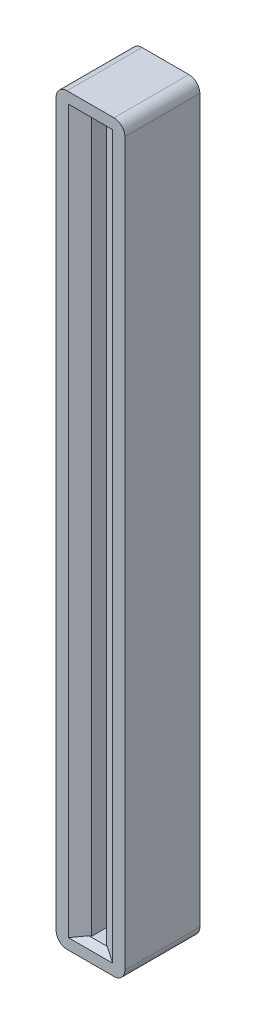
ISO-10303-21;
HEADER;
FILE_DESCRIPTION(('STEP AP214'),'2;1');
FILE_NAME('part.step','',(''),(''),'','','');
FILE_SCHEMA(('AUTOMOTIVE_DESIGN { 1 0 10303 214 1 1 1 1 }'));
ENDSEC;
DATA;
#1=APPLICATION_CONTEXT('core data for automotive mechanical design processes');
#2=APPLICATION_PROTOCOL_DEFINITION('international standard','automotive_design',2000,#1);
#3=PRODUCT_CONTEXT('',#1,'mechanical');
#4=PRODUCT('Part','Part','',(#3));
#5=PRODUCT_RELATED_PRODUCT_CATEGORY('part','',(#4));
#6=PRODUCT_DEFINITION_FORMATION('','',#4);
#7=PRODUCT_DEFINITION_CONTEXT('part definition',#1,'design');
#8=PRODUCT_DEFINITION('design','',#6,#7);
#9=PRODUCT_DEFINITION_SHAPE('','',#8);
#10=(LENGTH_UNIT() NAMED_UNIT(*) SI_UNIT(.MILLI.,.METRE.));
#11=(NAMED_UNIT(*) PLANE_ANGLE_UNIT() SI_UNIT($,.RADIAN.));
#12=(NAMED_UNIT(*) SI_UNIT($,.STERADIAN.) SOLID_ANGLE_UNIT());
#13=UNCERTAINTY_MEASURE_WITH_UNIT(LENGTH_MEASURE(1.E-05),#10,'distance_accuracy_value','');
#14=(GEOMETRIC_REPRESENTATION_CONTEXT(3) GLOBAL_UNCERTAINTY_ASSIGNED_CONTEXT((#13)) GLOBAL_UNIT_ASSIGNED_CONTEXT((#10,
#11,#12)) REPRESENTATION_CONTEXT('',''));
#15=CARTESIAN_POINT('',(0.,0.,0.));
#16=DIRECTION('',(0.,0.,1.));
#17=DIRECTION('',(1.,0.,0.));
#18=AXIS2_PLACEMENT_3D('',#15,#16,#17);
#19=CARTESIAN_POINT('',(-5.01650000000038,54.2925,10.9474));
#20=DIRECTION('',(1.,0.,0.));
#21=DIRECTION('',(0.,0.,-1.));
#22=AXIS2_PLACEMENT_3D('',#19,#20,#21);
#23=PLANE('',#22);
#24=DIRECTION('',(0.,-1.,0.));
#25=VECTOR('',#24,1.);
#26=CARTESIAN_POINT('',(-5.01650000000038,54.2925,0.));
#27=LINE('',#26,#25);
#28=CARTESIAN_POINT('',(-5.01650000000038,52.705,0.));
#29=VERTEX_POINT('',#28);
#30=CARTESIAN_POINT('',(-5.01649999999962,-52.705,0.));
#31=VERTEX_POINT('',#30);
#32=EDGE_CURVE('E175',#29,#31,#27,.T.);
#33=ORIENTED_EDGE('',*,*,#32,.T.);
#34=DIRECTION('',(0.,0.,-1.));
#35=VECTOR('',#34,1.);
#36=CARTESIAN_POINT('',(-5.01649999999962,-52.705,10.9474));
#37=LINE('',#36,#35);
#38=CARTESIAN_POINT('',(-5.01649999999962,-52.705,10.9474));
#39=VERTEX_POINT('',#38);
#40=EDGE_CURVE('E237',#31,#39,#37,.F.);
#41=ORIENTED_EDGE('',*,*,#40,.T.);
#42=DIRECTION('',(0.,-1.,0.));
#43=VECTOR('',#42,1.);
#44=CARTESIAN_POINT('',(-5.01650000000038,54.2925,10.9474));
#45=LINE('',#44,#43);
#46=CARTESIAN_POINT('',(-5.01650000000038,52.705,10.9474));
#47=VERTEX_POINT('',#46);
#48=EDGE_CURVE('E191',#47,#39,#45,.T.);
#49=ORIENTED_EDGE('',*,*,#48,.F.);
#50=DIRECTION('',(0.,0.,-1.));
#51=VECTOR('',#50,1.);
#52=CARTESIAN_POINT('',(-5.01650000000038,52.705,10.9474));
#53=LINE('',#52,#51);
#54=EDGE_CURVE('E234',#47,#29,#53,.T.);
#55=ORIENTED_EDGE('',*,*,#54,.T.);
#56=EDGE_LOOP('',(#33,#41,#49,#55));
#57=FACE_BOUND('',#56,.T.);
#58=ADVANCED_FACE('F32',(#57),#23,.F.);
#59=CARTESIAN_POINT('',(-5.01649999999962,-54.2925,10.9474));
#60=DIRECTION('',(0.,1.,0.));
#61=DIRECTION('',(0.,0.,1.));
#62=AXIS2_PLACEMENT_3D('',#59,#60,#61);
#63=PLANE('',#62);
#64=DIRECTION('',(1.,0.,0.));
#65=VECTOR('',#64,1.);
#66=CARTESIAN_POINT('',(-5.01649999999962,-54.2925,0.));
#67=LINE('',#66,#65);
#68=CARTESIAN_POINT('',(-3.42899999999961,-54.2925,0.));
#69=VERTEX_POINT('',#68);
#70=CARTESIAN_POINT('',(3.42900000000039,-54.2925,0.));
#71=VERTEX_POINT('',#70);
#72=EDGE_CURVE('E182',#69,#71,#67,.T.);
#73=ORIENTED_EDGE('',*,*,#72,.T.);
#74=DIRECTION('',(0.,0.,-1.));
#75=VECTOR('',#74,1.);
#76=CARTESIAN_POINT('',(3.42900000000039,-54.2925,10.9474));
#77=LINE('',#76,#75);
#78=CARTESIAN_POINT('',(3.42900000000039,-54.2925,10.9474));
#79=VERTEX_POINT('',#78);
#80=EDGE_CURVE('E232',#71,#79,#77,.F.);
#81=ORIENTED_EDGE('',*,*,#80,.T.);
#82=DIRECTION('',(1.,0.,0.));
#83=VECTOR('',#82,1.);
#84=CARTESIAN_POINT('',(-5.01649999999962,-54.2925,10.9474));
#85=LINE('',#84,#83);
#86=CARTESIAN_POINT('',(-3.42899999999961,-54.2925,10.9474));
#87=VERTEX_POINT('',#86);
#88=EDGE_CURVE('E194',#87,#79,#85,.T.);
#89=ORIENTED_EDGE('',*,*,#88,.F.);
#90=DIRECTION('',(0.,0.,-1.));
#91=VECTOR('',#90,1.);
#92=CARTESIAN_POINT('',(-3.42899999999961,-54.2925,10.9474));
#93=LINE('',#92,#91);
#94=EDGE_CURVE('E229',#87,#69,#93,.T.);
#95=ORIENTED_EDGE('',*,*,#94,.T.);
#96=EDGE_LOOP('',(#73,#81,#89,#95));
#97=FACE_BOUND('',#96,.T.);
#98=ADVANCED_FACE('F298',(#97),#63,.F.);
#99=CARTESIAN_POINT('',(5.01649999999962,54.2925,10.9474));
#100=DIRECTION('',(-1.,0.,0.));
#101=DIRECTION('',(0.,0.,1.));
#102=AXIS2_PLACEMENT_3D('',#99,#100,#101);
#103=PLANE('',#102);
#104=DIRECTION('',(0.,1.,0.));
#105=VECTOR('',#104,1.);
#106=CARTESIAN_POINT('',(5.01649999999962,54.2925,0.));
#107=LINE('',#106,#105);
#108=CARTESIAN_POINT('',(5.01650000000039,-52.705,0.));
#109=VERTEX_POINT('',#108);
#110=CARTESIAN_POINT('',(5.01649999999962,52.705,0.));
#111=VERTEX_POINT('',#110);
#112=EDGE_CURVE('E185',#109,#111,#107,.T.);
#113=ORIENTED_EDGE('',*,*,#112,.T.);
#114=DIRECTION('',(0.,0.,-1.));
#115=VECTOR('',#114,1.);
#116=CARTESIAN_POINT('',(5.01649999999962,52.705,10.9474));
#117=LINE('',#116,#115);
#118=CARTESIAN_POINT('',(5.01649999999962,52.705,10.9474));
#119=VERTEX_POINT('',#118);
#120=EDGE_CURVE('E219',#111,#119,#117,.F.);
#121=ORIENTED_EDGE('',*,*,#120,.T.);
#122=DIRECTION('',(0.,1.,0.));
#123=VECTOR('',#122,1.);
#124=CARTESIAN_POINT('',(5.01649999999962,54.2925,10.9474));
#125=LINE('',#124,#123);
#126=CARTESIAN_POINT('',(5.01650000000039,-52.705,10.9474));
#127=VERTEX_POINT('',#126);
#128=EDGE_CURVE('E197',#127,#119,#125,.T.);
#129=ORIENTED_EDGE('',*,*,#128,.F.);
#130=DIRECTION('',(0.,0.,-1.));
#131=VECTOR('',#130,1.);
#132=CARTESIAN_POINT('',(5.01650000000039,-52.705,10.9474));
#133=LINE('',#132,#131);
#134=EDGE_CURVE('E216',#127,#109,#133,.T.);
#135=ORIENTED_EDGE('',*,*,#134,.T.);
#136=EDGE_LOOP('',(#113,#121,#129,#135));
#137=FACE_BOUND('',#136,.T.);
#138=ADVANCED_FACE('F303',(#137),#103,.F.);
#139=CARTESIAN_POINT('',(-5.01650000000038,54.2925,10.9474));
#140=DIRECTION('',(0.,-1.,0.));
#141=DIRECTION('',(0.,0.,-1.));
#142=AXIS2_PLACEMENT_3D('',#139,#140,#141);
#143=PLANE('',#142);
#144=DIRECTION('',(-1.,0.,0.));
#145=VECTOR('',#144,1.);
#146=CARTESIAN_POINT('',(-5.01650000000038,54.2925,10.9474));
#147=LINE('',#146,#145);
#148=CARTESIAN_POINT('',(3.42899999999961,54.2925,10.9474));
#149=VERTEX_POINT('',#148);
#150=CARTESIAN_POINT('',(-3.42900000000038,54.2925,10.9474));
#151=VERTEX_POINT('',#150);
#152=EDGE_CURVE('E200',#149,#151,#147,.T.);
#153=ORIENTED_EDGE('',*,*,#152,.F.);
#154=DIRECTION('',(0.,0.,-1.));
#155=VECTOR('',#154,1.);
#156=CARTESIAN_POINT('',(3.42899999999961,54.2925,10.9474));
#157=LINE('',#156,#155);
#158=CARTESIAN_POINT('',(3.42899999999961,54.2925,0.));
#159=VERTEX_POINT('',#158);
#160=EDGE_CURVE('E205',#149,#159,#157,.T.);
#161=ORIENTED_EDGE('',*,*,#160,.T.);
#162=DIRECTION('',(-1.,0.,0.));
#163=VECTOR('',#162,1.);
#164=CARTESIAN_POINT('',(-5.01650000000038,54.2925,0.));
#165=LINE('',#164,#163);
#166=CARTESIAN_POINT('',(-3.42900000000038,54.2925,0.));
#167=VERTEX_POINT('',#166);
#168=EDGE_CURVE('E188',#159,#167,#165,.T.);
#169=ORIENTED_EDGE('',*,*,#168,.T.);
#170=DIRECTION('',(0.,0.,-1.));
#171=VECTOR('',#170,1.);
#172=CARTESIAN_POINT('',(-3.42900000000038,54.2925,10.9474));
#173=LINE('',#172,#171);
#174=EDGE_CURVE('E203',#167,#151,#173,.F.);
#175=ORIENTED_EDGE('',*,*,#174,.T.);
#176=EDGE_LOOP('',(#153,#161,#169,#175));
#177=FACE_BOUND('',#176,.T.);
#178=ADVANCED_FACE('F332',(#177),#143,.F.);
#179=CARTESIAN_POINT('',(-5.01649999999962,-54.2925,10.9474));
#180=DIRECTION('',(0.,0.,1.));
#181=DIRECTION('',(1.,0.,0.));
#182=AXIS2_PLACEMENT_3D('',#179,#180,#181);
#183=PLANE('',#182);
#184=DIRECTION('',(0.,-1.,0.));
#185=VECTOR('',#184,1.);
#186=CARTESIAN_POINT('',(3.23850000000017,-52.07,10.9474));
#187=LINE('',#186,#185);
#188=CARTESIAN_POINT('',(3.23849999999962,52.705,10.9474));
#189=VERTEX_POINT('',#188);
#190=CARTESIAN_POINT('',(3.2385000000004,-52.705,10.9474));
#191=VERTEX_POINT('',#190);
#192=EDGE_CURVE('E241',#189,#191,#187,.T.);
#193=ORIENTED_EDGE('',*,*,#192,.T.);
#194=DIRECTION('',(-1.,0.,0.));
#195=VECTOR('',#194,1.);
#196=CARTESIAN_POINT('',(-3.23849999999962,-52.705,10.9474));
#197=LINE('',#196,#195);
#198=CARTESIAN_POINT('',(-3.23849999999962,-52.705,10.9474));
#199=VERTEX_POINT('',#198);
#200=EDGE_CURVE('E262',#191,#199,#197,.T.);
#201=ORIENTED_EDGE('',*,*,#200,.T.);
#202=DIRECTION('',(0.,1.,0.));
#203=VECTOR('',#202,1.);
#204=CARTESIAN_POINT('',(-3.23850000000029,52.07,10.9474));
#205=LINE('',#204,#203);
#206=CARTESIAN_POINT('',(-3.2385000000004,52.705,10.9474));
#207=VERTEX_POINT('',#206);
#208=EDGE_CURVE('E243',#199,#207,#205,.T.);
#209=ORIENTED_EDGE('',*,*,#208,.T.);
#210=DIRECTION('',(1.,0.,0.));
#211=VECTOR('',#210,1.);
#212=CARTESIAN_POINT('',(3.23849999999962,52.705,10.9474));
#213=LINE('',#212,#211);
#214=EDGE_CURVE('E259',#207,#189,#213,.T.);
#215=ORIENTED_EDGE('',*,*,#214,.T.);
#216=EDGE_LOOP('',(#193,#201,#209,#215));
#217=FACE_BOUND('',#216,.T.);
#218=ORIENTED_EDGE('',*,*,#128,.T.);
#219=CARTESIAN_POINT('',(3.42899999999961,52.705,10.9474));
#220=DIRECTION('',(0.,0.,1.));
#221=DIRECTION('',(1.,0.,0.));
#222=AXIS2_PLACEMENT_3D('',#219,#220,#221);
#223=CIRCLE('',#222,1.5875);
#224=EDGE_CURVE('E227',#119,#149,#223,.T.);
#225=ORIENTED_EDGE('',*,*,#224,.T.);
#226=ORIENTED_EDGE('',*,*,#152,.T.);
#227=CARTESIAN_POINT('',(-3.42900000000039,52.705,10.9474));
#228=DIRECTION('',(0.,0.,1.));
#229=DIRECTION('',(1.,0.,0.));
#230=AXIS2_PLACEMENT_3D('',#227,#228,#229);
#231=CIRCLE('',#230,1.5875);
#232=EDGE_CURVE('E221',#151,#47,#231,.T.);
#233=ORIENTED_EDGE('',*,*,#232,.T.);
#234=ORIENTED_EDGE('',*,*,#48,.T.);
#235=CARTESIAN_POINT('',(-3.42899999999961,-52.705,10.9474));
#236=DIRECTION('',(0.,0.,1.));
#237=DIRECTION('',(1.,0.,0.));
#238=AXIS2_PLACEMENT_3D('',#235,#236,#237);
#239=CIRCLE('',#238,1.5875);
#240=EDGE_CURVE('E223',#39,#87,#239,.T.);
#241=ORIENTED_EDGE('',*,*,#240,.T.);
#242=ORIENTED_EDGE('',*,*,#88,.T.);
#243=CARTESIAN_POINT('',(3.42900000000039,-52.705,10.9474));
#244=DIRECTION('',(0.,0.,1.));
#245=DIRECTION('',(1.,0.,0.));
#246=AXIS2_PLACEMENT_3D('',#243,#244,#245);
#247=CIRCLE('',#246,1.5875);
#248=EDGE_CURVE('E225',#79,#127,#247,.T.);
#249=ORIENTED_EDGE('',*,*,#248,.T.);
#250=EDGE_LOOP('',(#218,#225,#226,#233,#234,#241,#242,#249));
#251=FACE_BOUND('',#250,.T.);
#252=ADVANCED_FACE('F275',(#217,#251),#183,.T.);
#253=CARTESIAN_POINT('',(-5.01649999999962,-54.2925,0.));
#254=DIRECTION('',(0.,0.,1.));
#255=DIRECTION('',(1.,0.,0.));
#256=AXIS2_PLACEMENT_3D('',#253,#254,#255);
#257=PLANE('',#256);
#258=ORIENTED_EDGE('',*,*,#168,.F.);
#259=CARTESIAN_POINT('',(3.42899999999961,52.705,0.));
#260=DIRECTION('',(0.,0.,1.));
#261=DIRECTION('',(1.,0.,0.));
#262=AXIS2_PLACEMENT_3D('',#259,#260,#261);
#263=CIRCLE('',#262,1.5875);
#264=EDGE_CURVE('E214',#159,#111,#263,.F.);
#265=ORIENTED_EDGE('',*,*,#264,.T.);
#266=ORIENTED_EDGE('',*,*,#112,.F.);
#267=CARTESIAN_POINT('',(3.42900000000039,-52.705,0.));
#268=DIRECTION('',(0.,0.,1.));
#269=DIRECTION('',(1.,0.,0.));
#270=AXIS2_PLACEMENT_3D('',#267,#268,#269);
#271=CIRCLE('',#270,1.5875);
#272=EDGE_CURVE('E212',#109,#71,#271,.F.);
#273=ORIENTED_EDGE('',*,*,#272,.T.);
#274=ORIENTED_EDGE('',*,*,#72,.F.);
#275=CARTESIAN_POINT('',(-3.42899999999961,-52.705,0.));
#276=DIRECTION('',(0.,0.,1.));
#277=DIRECTION('',(1.,0.,0.));
#278=AXIS2_PLACEMENT_3D('',#275,#276,#277);
#279=CIRCLE('',#278,1.5875);
#280=EDGE_CURVE('E210',#69,#31,#279,.F.);
#281=ORIENTED_EDGE('',*,*,#280,.T.);
#282=ORIENTED_EDGE('',*,*,#32,.F.);
#283=CARTESIAN_POINT('',(-3.42900000000039,52.705,0.));
#284=DIRECTION('',(0.,0.,1.));
#285=DIRECTION('',(1.,0.,0.));
#286=AXIS2_PLACEMENT_3D('',#283,#284,#285);
#287=CIRCLE('',#286,1.5875);
#288=EDGE_CURVE('E208',#29,#167,#287,.F.);
#289=ORIENTED_EDGE('',*,*,#288,.T.);
#290=EDGE_LOOP('',(#258,#265,#266,#273,#274,#281,#282,#289));
#291=FACE_BOUND('',#290,.T.);
#292=ADVANCED_FACE('F337',(#291),#257,.F.);
#293=CARTESIAN_POINT('',(3.42899999999961,52.705,10.9474));
#294=DIRECTION('',(0.,0.,-1.));
#295=DIRECTION('',(-1.,0.,0.));
#296=AXIS2_PLACEMENT_3D('',#293,#294,#295);
#297=CYLINDRICAL_SURFACE('',#296,1.5875);
#298=ORIENTED_EDGE('',*,*,#224,.F.);
#299=ORIENTED_EDGE('',*,*,#120,.F.);
#300=ORIENTED_EDGE('',*,*,#264,.F.);
#301=ORIENTED_EDGE('',*,*,#160,.F.);
#302=EDGE_LOOP('',(#298,#299,#300,#301));
#303=FACE_BOUND('',#302,.T.);
#304=ADVANCED_FACE('F327',(#303),#297,.T.);
#305=CARTESIAN_POINT('',(3.42900000000039,-52.705,10.9474));
#306=DIRECTION('',(0.,0.,-1.));
#307=DIRECTION('',(-1.,0.,0.));
#308=AXIS2_PLACEMENT_3D('',#305,#306,#307);
#309=CYLINDRICAL_SURFACE('',#308,1.5875);
#310=ORIENTED_EDGE('',*,*,#248,.F.);
#311=ORIENTED_EDGE('',*,*,#80,.F.);
#312=ORIENTED_EDGE('',*,*,#272,.F.);
#313=ORIENTED_EDGE('',*,*,#134,.F.);
#314=EDGE_LOOP('',(#310,#311,#312,#313));
#315=FACE_BOUND('',#314,.T.);
#316=ADVANCED_FACE('F319',(#315),#309,.T.);
#317=CARTESIAN_POINT('',(-3.42899999999961,-52.705,10.9474));
#318=DIRECTION('',(0.,0.,-1.));
#319=DIRECTION('',(-1.,0.,0.));
#320=AXIS2_PLACEMENT_3D('',#317,#318,#319);
#321=CYLINDRICAL_SURFACE('',#320,1.5875);
#322=ORIENTED_EDGE('',*,*,#240,.F.);
#323=ORIENTED_EDGE('',*,*,#40,.F.);
#324=ORIENTED_EDGE('',*,*,#280,.F.);
#325=ORIENTED_EDGE('',*,*,#94,.F.);
#326=EDGE_LOOP('',(#322,#323,#324,#325));
#327=FACE_BOUND('',#326,.T.);
#328=ADVANCED_FACE('F312',(#327),#321,.T.);
#329=CARTESIAN_POINT('',(-3.42900000000039,52.705,10.9474));
#330=DIRECTION('',(0.,0.,-1.));
#331=DIRECTION('',(-1.,0.,0.));
#332=AXIS2_PLACEMENT_3D('',#329,#330,#331);
#333=CYLINDRICAL_SURFACE('',#332,1.5875);
#334=ORIENTED_EDGE('',*,*,#232,.F.);
#335=ORIENTED_EDGE('',*,*,#174,.F.);
#336=ORIENTED_EDGE('',*,*,#288,.F.);
#337=ORIENTED_EDGE('',*,*,#54,.F.);
#338=EDGE_LOOP('',(#334,#335,#336,#337));
#339=FACE_BOUND('',#338,.T.);
#340=ADVANCED_FACE('F336',(#339),#333,.T.);
#341=CARTESIAN_POINT('',(1.07949999999973,52.07,4.21639999999999));
#342=DIRECTION('',(0.,1.,0.));
#343=DIRECTION('',(0.,0.,1.));
#344=AXIS2_PLACEMENT_3D('',#341,#342,#343);
#345=PLANE('',#344);
#346=DIRECTION('',(0.86602540378444,0.,0.499999999999998));
#347=VECTOR('',#346,1.);
#348=CARTESIAN_POINT('',(-1.29535849643679,52.07,8.32977557661471));
#349=LINE('',#348,#347);
#350=CARTESIAN_POINT('',(1.07949999999973,52.07,9.70090076881959));
#351=VERTEX_POINT('',#350);
#352=CARTESIAN_POINT('',(1.33349999999974,52.07,9.84754773719376));
#353=VERTEX_POINT('',#352);
#354=EDGE_CURVE('E252',#351,#353,#349,.T.);
#355=ORIENTED_EDGE('',*,*,#354,.T.);
#356=DIRECTION('',(-1.,0.,0.));
#357=VECTOR('',#356,1.);
#358=CARTESIAN_POINT('',(-3.23850000000029,52.07,9.84754773719376));
#359=LINE('',#358,#357);
#360=CARTESIAN_POINT('',(-1.33350000000028,52.07,9.84754773719376));
#361=VERTEX_POINT('',#360);
#362=EDGE_CURVE('E265',#353,#361,#359,.T.);
#363=ORIENTED_EDGE('',*,*,#362,.T.);
#364=DIRECTION('',(0.86602540378444,0.,-0.499999999999998));
#365=VECTOR('',#364,1.);
#366=CARTESIAN_POINT('',(2.91460849643626,52.07,7.39490115322941));
#367=LINE('',#366,#365);
#368=CARTESIAN_POINT('',(-1.07950000000027,52.07,9.70090076881959));
#369=VERTEX_POINT('',#368);
#370=EDGE_CURVE('E151',#361,#369,#367,.T.);
#371=ORIENTED_EDGE('',*,*,#370,.T.);
#372=DIRECTION('',(0.,0.,1.));
#373=VECTOR('',#372,1.);
#374=CARTESIAN_POINT('',(-1.07950000000027,52.07,4.21639999999999));
#375=LINE('',#374,#373);
#376=CARTESIAN_POINT('',(-1.07950000000027,52.07,4.21639999999999));
#377=VERTEX_POINT('',#376);
#378=EDGE_CURVE('E143',#377,#369,#375,.T.);
#379=ORIENTED_EDGE('',*,*,#378,.F.);
#380=DIRECTION('',(-1.,0.,0.));
#381=VECTOR('',#380,1.);
#382=CARTESIAN_POINT('',(1.07949999999973,52.07,4.21639999999999));
#383=LINE('',#382,#381);
#384=CARTESIAN_POINT('',(1.07949999999973,52.07,4.21639999999999));
#385=VERTEX_POINT('',#384);
#386=EDGE_CURVE('E148',#385,#377,#383,.T.);
#387=ORIENTED_EDGE('',*,*,#386,.F.);
#388=DIRECTION('',(0.,0.,1.));
#389=VECTOR('',#388,1.);
#390=CARTESIAN_POINT('',(1.07949999999973,52.07,4.21639999999999));
#391=LINE('',#390,#389);
#392=EDGE_CURVE('E173',#385,#351,#391,.T.);
#393=ORIENTED_EDGE('',*,*,#392,.T.);
#394=EDGE_LOOP('',(#355,#363,#371,#379,#387,#393));
#395=FACE_BOUND('',#394,.T.);
#396=ADVANCED_FACE('F145',(#395),#345,.F.);
#397=CARTESIAN_POINT('',(1.07950000000027,-52.07,4.21639999999999));
#398=DIRECTION('',(1.,0.,0.));
#399=DIRECTION('',(0.,0.,-1.));
#400=AXIS2_PLACEMENT_3D('',#397,#398,#399);
#401=PLANE('',#400);
#402=DIRECTION('',(0.,0.,1.));
#403=VECTOR('',#402,1.);
#404=CARTESIAN_POINT('',(1.07950000000027,-52.07,4.21639999999999));
#405=LINE('',#404,#403);
#406=CARTESIAN_POINT('',(1.07950000000027,-52.07,4.21639999999999));
#407=VERTEX_POINT('',#406);
#408=CARTESIAN_POINT('',(1.07950000000027,-52.07,9.70090076881959));
#409=VERTEX_POINT('',#408);
#410=EDGE_CURVE('E176',#407,#409,#405,.T.);
#411=ORIENTED_EDGE('',*,*,#410,.T.);
#412=DIRECTION('',(0.,1.,0.));
#413=VECTOR('',#412,1.);
#414=CARTESIAN_POINT('',(1.07949999999973,52.07,9.70090076881959));
#415=LINE('',#414,#413);
#416=EDGE_CURVE('E245',#409,#351,#415,.T.);
#417=ORIENTED_EDGE('',*,*,#416,.T.);
#418=ORIENTED_EDGE('',*,*,#392,.F.);
#419=DIRECTION('',(0.,1.,0.));
#420=VECTOR('',#419,1.);
#421=CARTESIAN_POINT('',(1.07950000000027,-52.07,4.21639999999999));
#422=LINE('',#421,#420);
#423=EDGE_CURVE('E156',#407,#385,#422,.T.);
#424=ORIENTED_EDGE('',*,*,#423,.F.);
#425=EDGE_LOOP('',(#411,#417,#418,#424));
#426=FACE_BOUND('',#425,.T.);
#427=ADVANCED_FACE('F286',(#426),#401,.F.);
#428=CARTESIAN_POINT('',(1.07950000000027,-52.07,4.21639999999999));
#429=DIRECTION('',(0.,-1.,0.));
#430=DIRECTION('',(0.,0.,-1.));
#431=AXIS2_PLACEMENT_3D('',#428,#429,#430);
#432=PLANE('',#431);
#433=DIRECTION('',(-0.86602540378444,0.,0.499999999999998));
#434=VECTOR('',#433,1.);
#435=CARTESIAN_POINT('',(2.9146084964368,-52.07,7.39490115322941));
#436=LINE('',#435,#434);
#437=CARTESIAN_POINT('',(-1.07949999999973,-52.07,9.70090076881959));
#438=VERTEX_POINT('',#437);
#439=CARTESIAN_POINT('',(-1.33349999999974,-52.07,9.84754773719376));
#440=VERTEX_POINT('',#439);
#441=EDGE_CURVE('E248',#438,#440,#436,.T.);
#442=ORIENTED_EDGE('',*,*,#441,.T.);
#443=DIRECTION('',(1.,0.,0.));
#444=VECTOR('',#443,1.);
#445=CARTESIAN_POINT('',(3.23850000000017,-52.07,9.84754773719376));
#446=LINE('',#445,#444);
#447=CARTESIAN_POINT('',(1.33350000000028,-52.07,9.84754773719376));
#448=VERTEX_POINT('',#447);
#449=EDGE_CURVE('E256',#440,#448,#446,.T.);
#450=ORIENTED_EDGE('',*,*,#449,.T.);
#451=DIRECTION('',(-0.86602540378444,0.,-0.499999999999998));
#452=VECTOR('',#451,1.);
#453=CARTESIAN_POINT('',(-1.29535849643625,-52.07,8.32977557661471));
#454=LINE('',#453,#452);
#455=EDGE_CURVE('E254',#448,#409,#454,.T.);
#456=ORIENTED_EDGE('',*,*,#455,.T.);
#457=ORIENTED_EDGE('',*,*,#410,.F.);
#458=DIRECTION('',(1.,0.,0.));
#459=VECTOR('',#458,1.);
#460=CARTESIAN_POINT('',(1.07950000000027,-52.07,4.21639999999999));
#461=LINE('',#460,#459);
#462=CARTESIAN_POINT('',(-1.07949999999973,-52.07,4.21639999999999));
#463=VERTEX_POINT('',#462);
#464=EDGE_CURVE('E165',#463,#407,#461,.T.);
#465=ORIENTED_EDGE('',*,*,#464,.F.);
#466=DIRECTION('',(0.,0.,1.));
#467=VECTOR('',#466,1.);
#468=CARTESIAN_POINT('',(-1.07949999999973,-52.07,4.21639999999999));
#469=LINE('',#468,#467);
#470=EDGE_CURVE('E155',#463,#438,#469,.T.);
#471=ORIENTED_EDGE('',*,*,#470,.T.);
#472=EDGE_LOOP('',(#442,#450,#456,#457,#465,#471));
#473=FACE_BOUND('',#472,.T.);
#474=ADVANCED_FACE('F283',(#473),#432,.F.);
#475=CARTESIAN_POINT('',(-1.07949999999973,-52.07,4.21639999999999));
#476=DIRECTION('',(-1.,0.,0.));
#477=DIRECTION('',(0.,0.,1.));
#478=AXIS2_PLACEMENT_3D('',#475,#476,#477);
#479=PLANE('',#478);
#480=ORIENTED_EDGE('',*,*,#378,.T.);
#481=DIRECTION('',(0.,-1.,0.));
#482=VECTOR('',#481,1.);
#483=CARTESIAN_POINT('',(-1.07949999999973,-52.07,9.70090076881959));
#484=LINE('',#483,#482);
#485=EDGE_CURVE('E239',#369,#438,#484,.T.);
#486=ORIENTED_EDGE('',*,*,#485,.T.);
#487=ORIENTED_EDGE('',*,*,#470,.F.);
#488=DIRECTION('',(0.,-1.,0.));
#489=VECTOR('',#488,1.);
#490=CARTESIAN_POINT('',(-1.07949999999973,-52.07,4.21639999999999));
#491=LINE('',#490,#489);
#492=EDGE_CURVE('E159',#377,#463,#491,.T.);
#493=ORIENTED_EDGE('',*,*,#492,.F.);
#494=EDGE_LOOP('',(#480,#486,#487,#493));
#495=FACE_BOUND('',#494,.T.);
#496=ADVANCED_FACE('F160',(#495),#479,.F.);
#497=CARTESIAN_POINT('',(-1.07950000000027,52.07,4.21639999999999));
#498=DIRECTION('',(0.,0.,-1.));
#499=DIRECTION('',(-1.,0.,0.));
#500=AXIS2_PLACEMENT_3D('',#497,#498,#499);
#501=PLANE('',#500);
#502=ORIENTED_EDGE('',*,*,#386,.T.);
#503=ORIENTED_EDGE('',*,*,#492,.T.);
#504=ORIENTED_EDGE('',*,*,#464,.T.);
#505=ORIENTED_EDGE('',*,*,#423,.T.);
#506=EDGE_LOOP('',(#502,#503,#504,#505));
#507=FACE_BOUND('',#506,.T.);
#508=ADVANCED_FACE('F167',(#507),#501,.F.);
#509=CARTESIAN_POINT('',(-1.07949999999973,-52.07,9.70090076881959));
#510=DIRECTION('',(0.499999999999998,0.,0.86602540378444));
#511=DIRECTION('',(0.86602540378444,0.,-0.499999999999998));
#512=AXIS2_PLACEMENT_3D('',#509,#510,#511);
#513=PLANE('',#512);
#514=ORIENTED_EDGE('',*,*,#370,.F.);
#515=DIRECTION('',(-0.832050294337844,0.277350098112616,0.480384461415259));
#516=VECTOR('',#515,1.);
#517=CARTESIAN_POINT('',(0.337038461538191,51.5131538461538,8.88306190673291));
#518=LINE('',#517,#516);
#519=EDGE_CURVE('E39',#361,#207,#518,.T.);
#520=ORIENTED_EDGE('',*,*,#519,.T.);
#521=ORIENTED_EDGE('',*,*,#208,.F.);
#522=DIRECTION('',(0.832050294337845,0.277350098112613,-0.48038446141526));
#523=VECTOR('',#522,1.);
#524=CARTESIAN_POINT('',(0.337038461538732,-51.5131538461538,8.88306190673291));
#525=LINE('',#524,#523);
#526=EDGE_CURVE('E270',#199,#440,#525,.T.);
#527=ORIENTED_EDGE('',*,*,#526,.T.);
#528=ORIENTED_EDGE('',*,*,#441,.F.);
#529=ORIENTED_EDGE('',*,*,#485,.F.);
#530=EDGE_LOOP('',(#514,#520,#521,#527,#528,#529));
#531=FACE_BOUND('',#530,.T.);
#532=ADVANCED_FACE('F272',(#531),#513,.T.);
#533=CARTESIAN_POINT('',(1.07950000000027,-52.07,9.70090076881959));
#534=DIRECTION('',(-0.499999999999998,0.,0.86602540378444));
#535=DIRECTION('',(0.86602540378444,0.,0.499999999999998));
#536=AXIS2_PLACEMENT_3D('',#533,#534,#535);
#537=PLANE('',#536);
#538=ORIENTED_EDGE('',*,*,#455,.F.);
#539=DIRECTION('',(0.832050294337845,-0.277350098112613,0.48038446141526));
#540=VECTOR('',#539,1.);
#541=CARTESIAN_POINT('',(1.15765384615412,-52.0113846153846,9.74602291293472));
#542=LINE('',#541,#540);
#543=EDGE_CURVE('E267',#448,#191,#542,.T.);
#544=ORIENTED_EDGE('',*,*,#543,.T.);
#545=ORIENTED_EDGE('',*,*,#192,.F.);
#546=DIRECTION('',(-0.832050294337844,-0.277350098112616,-0.480384461415259));
#547=VECTOR('',#546,1.);
#548=CARTESIAN_POINT('',(1.15765384615358,52.0113846153846,9.74602291293472));
#549=LINE('',#548,#547);
#550=EDGE_CURVE('E11',#189,#353,#549,.T.);
#551=ORIENTED_EDGE('',*,*,#550,.T.);
#552=ORIENTED_EDGE('',*,*,#354,.F.);
#553=ORIENTED_EDGE('',*,*,#416,.F.);
#554=EDGE_LOOP('',(#538,#544,#545,#551,#552,#553));
#555=FACE_BOUND('',#554,.T.);
#556=ADVANCED_FACE('F288',(#555),#537,.T.);
#557=CARTESIAN_POINT('',(1.07950000000027,-52.07,9.84754773719376));
#558=DIRECTION('',(0.,0.866025403784439,0.5));
#559=DIRECTION('',(0.,-0.5,0.866025403784439));
#560=AXIS2_PLACEMENT_3D('',#557,#558,#559);
#561=PLANE('',#560);
#562=ORIENTED_EDGE('',*,*,#526,.F.);
#563=ORIENTED_EDGE('',*,*,#200,.F.);
#564=ORIENTED_EDGE('',*,*,#543,.F.);
#565=ORIENTED_EDGE('',*,*,#449,.F.);
#566=EDGE_LOOP('',(#562,#563,#564,#565));
#567=FACE_BOUND('',#566,.T.);
#568=ADVANCED_FACE('F281',(#567),#561,.T.);
#569=CARTESIAN_POINT('',(1.07949999999973,52.07,9.84754773719376));
#570=DIRECTION('',(0.,-0.866025403784436,0.500000000000004));
#571=DIRECTION('',(0.,-0.500000000000004,-0.866025403784436));
#572=AXIS2_PLACEMENT_3D('',#569,#570,#571);
#573=PLANE('',#572);
#574=ORIENTED_EDGE('',*,*,#550,.F.);
#575=ORIENTED_EDGE('',*,*,#214,.F.);
#576=ORIENTED_EDGE('',*,*,#519,.F.);
#577=ORIENTED_EDGE('',*,*,#362,.F.);
#578=EDGE_LOOP('',(#574,#575,#576,#577));
#579=FACE_BOUND('',#578,.T.);
#580=ADVANCED_FACE('F273',(#579),#573,.T.);
#581=CLOSED_SHELL('',(#58,#98,#138,#178,#252,#292,#304,#316,#328,#340,#396,#427,#474,#496,#508,
#532,#556,#568,#580));
#582=MANIFOLD_SOLID_BREP('B2',#581);
#583=ADVANCED_BREP_SHAPE_REPRESENTATION('',(#18,#582),#14);
#584=SHAPE_DEFINITION_REPRESENTATION(#9,#583);
ENDSEC;
END-ISO-10303-21;
